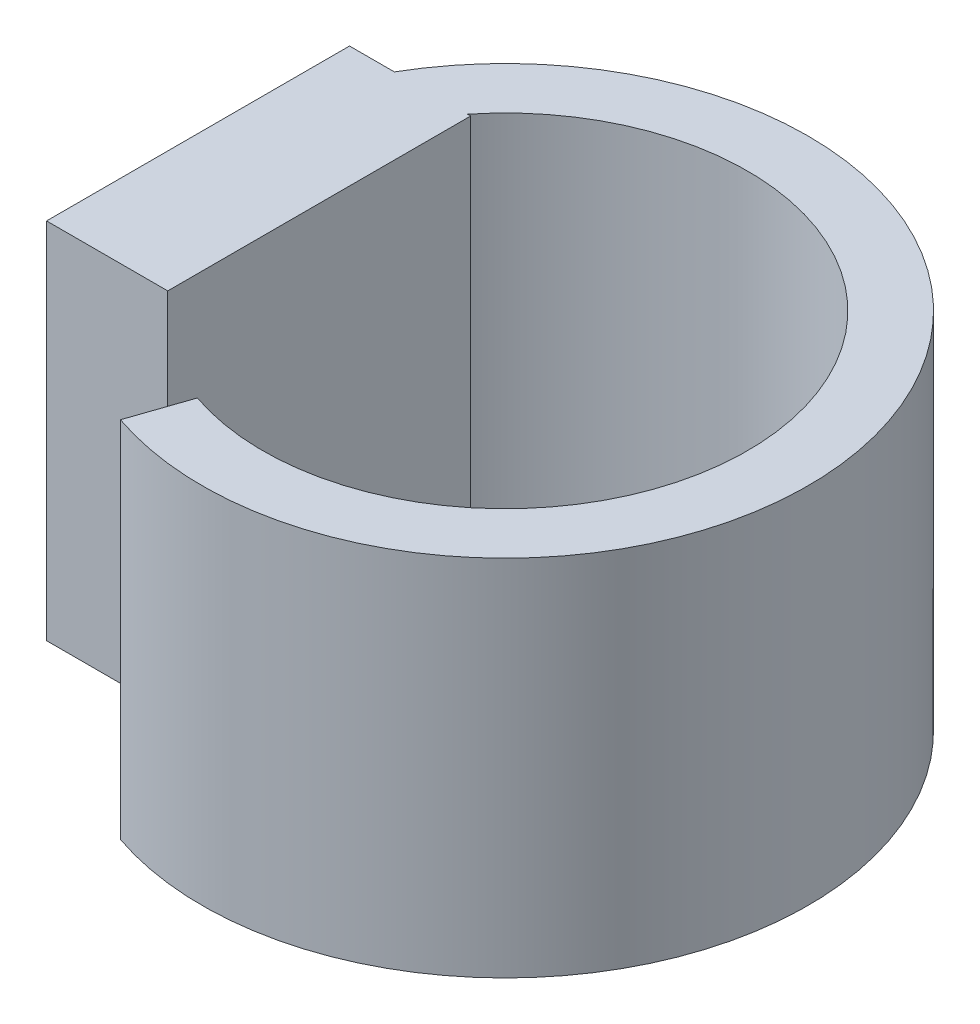
ISO-10303-21;
HEADER;
FILE_DESCRIPTION(('STEP AP214'),'2;1');
FILE_NAME('part.step','',(''),(''),'','','');
FILE_SCHEMA(('AUTOMOTIVE_DESIGN { 1 0 10303 214 1 1 1 1 }'));
ENDSEC;
DATA;
#1=APPLICATION_CONTEXT('core data for automotive mechanical design processes');
#2=APPLICATION_PROTOCOL_DEFINITION('international standard','automotive_design',2000,#1);
#3=PRODUCT_CONTEXT('',#1,'mechanical');
#4=PRODUCT('Part','Part','',(#3));
#5=PRODUCT_RELATED_PRODUCT_CATEGORY('part','',(#4));
#6=PRODUCT_DEFINITION_FORMATION('','',#4);
#7=PRODUCT_DEFINITION_CONTEXT('part definition',#1,'design');
#8=PRODUCT_DEFINITION('design','',#6,#7);
#9=PRODUCT_DEFINITION_SHAPE('','',#8);
#10=(LENGTH_UNIT() NAMED_UNIT(*) SI_UNIT(.MILLI.,.METRE.));
#11=(NAMED_UNIT(*) PLANE_ANGLE_UNIT() SI_UNIT($,.RADIAN.));
#12=(NAMED_UNIT(*) SI_UNIT($,.STERADIAN.) SOLID_ANGLE_UNIT());
#13=UNCERTAINTY_MEASURE_WITH_UNIT(LENGTH_MEASURE(1.E-05),#10,'distance_accuracy_value','');
#14=(GEOMETRIC_REPRESENTATION_CONTEXT(3) GLOBAL_UNCERTAINTY_ASSIGNED_CONTEXT((#13)) GLOBAL_UNIT_ASSIGNED_CONTEXT((#10,
#11,#12)) REPRESENTATION_CONTEXT('',''));
#15=CARTESIAN_POINT('',(0.,0.,0.));
#16=DIRECTION('',(0.,0.,1.));
#17=DIRECTION('',(1.,0.,0.));
#18=AXIS2_PLACEMENT_3D('',#15,#16,#17);
#19=CARTESIAN_POINT('',(0.,12.,0.));
#20=DIRECTION('',(1.,0.,0.));
#21=DIRECTION('',(0.,0.,-1.));
#22=AXIS2_PLACEMENT_3D('',#19,#20,#21);
#23=PLANE('',#22);
#24=DIRECTION('',(0.,0.,1.));
#25=VECTOR('',#24,1.);
#26=CARTESIAN_POINT('',(0.,0.,0.));
#27=LINE('',#26,#25);
#28=CARTESIAN_POINT('',(0.,0.,-10.));
#29=VERTEX_POINT('',#28);
#30=CARTESIAN_POINT('',(0.,0.,0.));
#31=VERTEX_POINT('',#30);
#32=EDGE_CURVE('E129',#29,#31,#27,.T.);
#33=ORIENTED_EDGE('',*,*,#32,.T.);
#34=DIRECTION('',(0.,-1.,0.));
#35=VECTOR('',#34,1.);
#36=CARTESIAN_POINT('',(0.,12.,0.));
#37=LINE('',#36,#35);
#38=CARTESIAN_POINT('',(0.,12.,0.));
#39=VERTEX_POINT('',#38);
#40=EDGE_CURVE('E11',#39,#31,#37,.T.);
#41=ORIENTED_EDGE('',*,*,#40,.F.);
#42=DIRECTION('',(0.,0.,1.));
#43=VECTOR('',#42,1.);
#44=CARTESIAN_POINT('',(0.,12.,0.));
#45=LINE('',#44,#43);
#46=CARTESIAN_POINT('',(0.,12.,-10.));
#47=VERTEX_POINT('',#46);
#48=EDGE_CURVE('E143',#47,#39,#45,.T.);
#49=ORIENTED_EDGE('',*,*,#48,.F.);
#50=DIRECTION('',(0.,-1.,0.));
#51=VECTOR('',#50,1.);
#52=CARTESIAN_POINT('',(0.,12.,-10.));
#53=LINE('',#52,#51);
#54=EDGE_CURVE('E125',#47,#29,#53,.T.);
#55=ORIENTED_EDGE('',*,*,#54,.T.);
#56=EDGE_LOOP('',(#33,#41,#49,#55));
#57=FACE_BOUND('',#56,.T.);
#58=ADVANCED_FACE('F33',(#57),#23,.F.);
#59=CARTESIAN_POINT('',(0.,12.,0.));
#60=DIRECTION('',(0.,0.,-1.));
#61=DIRECTION('',(-1.,0.,0.));
#62=AXIS2_PLACEMENT_3D('',#59,#60,#61);
#63=PLANE('',#62);
#64=DIRECTION('',(1.,0.,0.));
#65=VECTOR('',#64,1.);
#66=CARTESIAN_POINT('',(0.,0.,0.));
#67=LINE('',#66,#65);
#68=CARTESIAN_POINT('',(4.,0.,0.));
#69=VERTEX_POINT('',#68);
#70=EDGE_CURVE('E132',#31,#69,#67,.T.);
#71=ORIENTED_EDGE('',*,*,#70,.T.);
#72=DIRECTION('',(0.,-1.,0.));
#73=VECTOR('',#72,1.);
#74=CARTESIAN_POINT('',(4.,12.,0.));
#75=LINE('',#74,#73);
#76=CARTESIAN_POINT('',(4.,12.,0.));
#77=VERTEX_POINT('',#76);
#78=EDGE_CURVE('E41',#77,#69,#75,.T.);
#79=ORIENTED_EDGE('',*,*,#78,.F.);
#80=DIRECTION('',(1.,0.,0.));
#81=VECTOR('',#80,1.);
#82=CARTESIAN_POINT('',(0.,12.,0.));
#83=LINE('',#82,#81);
#84=EDGE_CURVE('E92',#39,#77,#83,.T.);
#85=ORIENTED_EDGE('',*,*,#84,.F.);
#86=ORIENTED_EDGE('',*,*,#40,.T.);
#87=EDGE_LOOP('',(#71,#79,#85,#86));
#88=FACE_BOUND('',#87,.T.);
#89=ADVANCED_FACE('F178',(#88),#63,.F.);
#90=CARTESIAN_POINT('',(4.,12.,0.));
#91=DIRECTION('',(-1.,0.,0.));
#92=DIRECTION('',(0.,0.,1.));
#93=AXIS2_PLACEMENT_3D('',#90,#91,#92);
#94=PLANE('',#93);
#95=DIRECTION('',(0.,0.,-1.));
#96=VECTOR('',#95,1.);
#97=CARTESIAN_POINT('',(4.,0.,0.));
#98=LINE('',#97,#96);
#99=CARTESIAN_POINT('',(4.,0.,-10.));
#100=VERTEX_POINT('',#99);
#101=EDGE_CURVE('E134',#69,#100,#98,.T.);
#102=ORIENTED_EDGE('',*,*,#101,.T.);
#103=DIRECTION('',(0.,-1.,0.));
#104=VECTOR('',#103,1.);
#105=CARTESIAN_POINT('',(4.,12.,-10.));
#106=LINE('',#105,#104);
#107=CARTESIAN_POINT('',(4.,12.,-10.));
#108=VERTEX_POINT('',#107);
#109=EDGE_CURVE('E150',#108,#100,#106,.T.);
#110=ORIENTED_EDGE('',*,*,#109,.F.);
#111=DIRECTION('',(0.,0.,-1.));
#112=VECTOR('',#111,1.);
#113=CARTESIAN_POINT('',(4.,12.,0.));
#114=LINE('',#113,#112);
#115=EDGE_CURVE('E158',#77,#108,#114,.T.);
#116=ORIENTED_EDGE('',*,*,#115,.F.);
#117=ORIENTED_EDGE('',*,*,#78,.T.);
#118=EDGE_LOOP('',(#102,#110,#116,#117));
#119=FACE_BOUND('',#118,.T.);
#120=ADVANCED_FACE('F156',(#119),#94,.F.);
#121=CARTESIAN_POINT('',(3.89619072953186,12.,-10.));
#122=DIRECTION('',(0.,0.,1.));
#123=DIRECTION('',(1.,0.,0.));
#124=AXIS2_PLACEMENT_3D('',#121,#122,#123);
#125=PLANE('',#124);
#126=DIRECTION('',(-1.,0.,0.));
#127=VECTOR('',#126,1.);
#128=CARTESIAN_POINT('',(3.89619072953186,0.,-10.));
#129=LINE('',#128,#127);
#130=CARTESIAN_POINT('',(3.89619072953186,0.,-10.));
#131=VERTEX_POINT('',#130);
#132=EDGE_CURVE('E136',#100,#131,#129,.T.);
#133=ORIENTED_EDGE('',*,*,#132,.T.);
#134=DIRECTION('',(0.,-1.,0.));
#135=VECTOR('',#134,1.);
#136=CARTESIAN_POINT('',(3.89619072953186,12.,-10.));
#137=LINE('',#136,#135);
#138=CARTESIAN_POINT('',(3.89619072953186,12.,-10.));
#139=VERTEX_POINT('',#138);
#140=EDGE_CURVE('E147',#139,#131,#137,.T.);
#141=ORIENTED_EDGE('',*,*,#140,.F.);
#142=DIRECTION('',(-1.,0.,0.));
#143=VECTOR('',#142,1.);
#144=CARTESIAN_POINT('',(3.89619072953186,12.,-10.));
#145=LINE('',#144,#143);
#146=EDGE_CURVE('E170',#108,#139,#145,.T.);
#147=ORIENTED_EDGE('',*,*,#146,.F.);
#148=ORIENTED_EDGE('',*,*,#109,.T.);
#149=EDGE_LOOP('',(#133,#141,#147,#148));
#150=FACE_BOUND('',#149,.T.);
#151=ADVANCED_FACE('F166',(#150),#125,.F.);
#152=CARTESIAN_POINT('',(10.1389820031373,12.,-4.99724504755669));
#153=DIRECTION('',(0.,-1.,0.));
#154=DIRECTION('',(0.,0.,-1.));
#155=AXIS2_PLACEMENT_3D('',#152,#153,#154);
#156=CYLINDRICAL_SURFACE('',#155,8.);
#157=CARTESIAN_POINT('',(10.1389820031373,0.,-4.99724504755669));
#158=DIRECTION('',(0.,-1.,0.));
#159=DIRECTION('',(0.,0.,1.));
#160=AXIS2_PLACEMENT_3D('',#157,#158,#159);
#161=CIRCLE('',#160,8.);
#162=CARTESIAN_POINT('',(7.55030258883941,0.,2.5723479989677));
#163=VERTEX_POINT('',#162);
#164=EDGE_CURVE('E138',#131,#163,#161,.T.);
#165=ORIENTED_EDGE('',*,*,#164,.T.);
#166=DIRECTION('',(0.,-1.,0.));
#167=VECTOR('',#166,1.);
#168=CARTESIAN_POINT('',(7.55030258883941,12.,2.5723479989677));
#169=LINE('',#168,#167);
#170=CARTESIAN_POINT('',(7.55030258883941,12.,2.5723479989677));
#171=VERTEX_POINT('',#170);
#172=EDGE_CURVE('E120',#171,#163,#169,.T.);
#173=ORIENTED_EDGE('',*,*,#172,.F.);
#174=CARTESIAN_POINT('',(10.1389820031373,12.,-4.99724504755669));
#175=DIRECTION('',(0.,-1.,0.));
#176=DIRECTION('',(0.,0.,1.));
#177=AXIS2_PLACEMENT_3D('',#174,#175,#176);
#178=CIRCLE('',#177,8.);
#179=EDGE_CURVE('E111',#139,#171,#178,.T.);
#180=ORIENTED_EDGE('',*,*,#179,.F.);
#181=ORIENTED_EDGE('',*,*,#140,.T.);
#182=EDGE_LOOP('',(#165,#173,#180,#181));
#183=FACE_BOUND('',#182,.T.);
#184=ADVANCED_FACE('F169',(#183),#156,.F.);
#185=CARTESIAN_POINT('',(7.55030258883941,12.,2.5723479989677));
#186=DIRECTION('',(0.946199130815549,0.,0.323584926787234));
#187=DIRECTION('',(0.323584926787234,0.,-0.946199130815549));
#188=AXIS2_PLACEMENT_3D('',#185,#186,#187);
#189=PLANE('',#188);
#190=DIRECTION('',(-0.323584926787234,0.,0.946199130815549));
#191=VECTOR('',#190,1.);
#192=CARTESIAN_POINT('',(7.55030258883941,0.,2.5723479989677));
#193=LINE('',#192,#191);
#194=CARTESIAN_POINT('',(6.90313273526494,0.,4.4647462605988));
#195=VERTEX_POINT('',#194);
#196=EDGE_CURVE('E119',#163,#195,#193,.T.);
#197=ORIENTED_EDGE('',*,*,#196,.T.);
#198=DIRECTION('',(0.,-1.,0.));
#199=VECTOR('',#198,1.);
#200=CARTESIAN_POINT('',(6.90313273526494,12.,4.4647462605988));
#201=LINE('',#200,#199);
#202=CARTESIAN_POINT('',(6.90313273526494,12.,4.4647462605988));
#203=VERTEX_POINT('',#202);
#204=EDGE_CURVE('E116',#203,#195,#201,.T.);
#205=ORIENTED_EDGE('',*,*,#204,.F.);
#206=DIRECTION('',(-0.323584926787234,0.,0.946199130815549));
#207=VECTOR('',#206,1.);
#208=CARTESIAN_POINT('',(7.55030258883941,12.,2.5723479989677));
#209=LINE('',#208,#207);
#210=EDGE_CURVE('E105',#171,#203,#209,.T.);
#211=ORIENTED_EDGE('',*,*,#210,.F.);
#212=ORIENTED_EDGE('',*,*,#172,.T.);
#213=EDGE_LOOP('',(#197,#205,#211,#212));
#214=FACE_BOUND('',#213,.T.);
#215=ADVANCED_FACE('F117',(#214),#189,.F.);
#216=CARTESIAN_POINT('',(10.1389820031373,12.,-4.99724504755669));
#217=DIRECTION('',(0.,-1.,0.));
#218=DIRECTION('',(0.,0.,-1.));
#219=AXIS2_PLACEMENT_3D('',#216,#217,#218);
#220=CYLINDRICAL_SURFACE('',#219,10.);
#221=CARTESIAN_POINT('',(10.1389820031373,0.,-4.99724504755669));
#222=DIRECTION('',(0.,1.,0.));
#223=DIRECTION('',(0.,0.,1.));
#224=AXIS2_PLACEMENT_3D('',#221,#222,#223);
#225=CIRCLE('',#224,10.);
#226=CARTESIAN_POINT('',(1.48031912219522,0.,-10.));
#227=VERTEX_POINT('',#226);
#228=EDGE_CURVE('E78',#195,#227,#225,.T.);
#229=ORIENTED_EDGE('',*,*,#228,.T.);
#230=DIRECTION('',(0.,-1.,0.));
#231=VECTOR('',#230,1.);
#232=CARTESIAN_POINT('',(1.48031912219522,12.,-10.));
#233=LINE('',#232,#231);
#234=CARTESIAN_POINT('',(1.48031912219522,12.,-10.));
#235=VERTEX_POINT('',#234);
#236=EDGE_CURVE('E121',#235,#227,#233,.T.);
#237=ORIENTED_EDGE('',*,*,#236,.F.);
#238=CARTESIAN_POINT('',(10.1389820031373,12.,-4.99724504755669));
#239=DIRECTION('',(0.,1.,0.));
#240=DIRECTION('',(0.,0.,1.));
#241=AXIS2_PLACEMENT_3D('',#238,#239,#240);
#242=CIRCLE('',#241,10.);
#243=EDGE_CURVE('E109',#203,#235,#242,.T.);
#244=ORIENTED_EDGE('',*,*,#243,.F.);
#245=ORIENTED_EDGE('',*,*,#204,.T.);
#246=EDGE_LOOP('',(#229,#237,#244,#245));
#247=FACE_BOUND('',#246,.T.);
#248=ADVANCED_FACE('F123',(#247),#220,.T.);
#249=CARTESIAN_POINT('',(0.,12.,-10.));
#250=DIRECTION('',(0.,0.,1.));
#251=DIRECTION('',(1.,0.,0.));
#252=AXIS2_PLACEMENT_3D('',#249,#250,#251);
#253=PLANE('',#252);
#254=DIRECTION('',(-1.,0.,0.));
#255=VECTOR('',#254,1.);
#256=CARTESIAN_POINT('',(0.,0.,-10.));
#257=LINE('',#256,#255);
#258=EDGE_CURVE('E84',#227,#29,#257,.T.);
#259=ORIENTED_EDGE('',*,*,#258,.T.);
#260=ORIENTED_EDGE('',*,*,#54,.F.);
#261=DIRECTION('',(-1.,0.,0.));
#262=VECTOR('',#261,1.);
#263=CARTESIAN_POINT('',(0.,12.,-10.));
#264=LINE('',#263,#262);
#265=EDGE_CURVE('E49',#235,#47,#264,.T.);
#266=ORIENTED_EDGE('',*,*,#265,.F.);
#267=ORIENTED_EDGE('',*,*,#236,.T.);
#268=EDGE_LOOP('',(#259,#260,#266,#267));
#269=FACE_BOUND('',#268,.T.);
#270=ADVANCED_FACE('F194',(#269),#253,.F.);
#271=CARTESIAN_POINT('',(10.1389820031373,12.,-4.99724504755669));
#272=DIRECTION('',(0.,1.,0.));
#273=DIRECTION('',(0.,0.,1.));
#274=AXIS2_PLACEMENT_3D('',#271,#272,#273);
#275=PLANE('',#274);
#276=ORIENTED_EDGE('',*,*,#48,.T.);
#277=ORIENTED_EDGE('',*,*,#84,.T.);
#278=ORIENTED_EDGE('',*,*,#115,.T.);
#279=ORIENTED_EDGE('',*,*,#146,.T.);
#280=ORIENTED_EDGE('',*,*,#179,.T.);
#281=ORIENTED_EDGE('',*,*,#210,.T.);
#282=ORIENTED_EDGE('',*,*,#243,.T.);
#283=ORIENTED_EDGE('',*,*,#265,.T.);
#284=EDGE_LOOP('',(#276,#277,#278,#279,#280,#281,#282,#283));
#285=FACE_BOUND('',#284,.T.);
#286=ADVANCED_FACE('F107',(#285),#275,.T.);
#287=CARTESIAN_POINT('',(10.1389820031373,0.,-4.99724504755669));
#288=DIRECTION('',(0.,1.,0.));
#289=DIRECTION('',(0.,0.,1.));
#290=AXIS2_PLACEMENT_3D('',#287,#288,#289);
#291=PLANE('',#290);
#292=ORIENTED_EDGE('',*,*,#32,.F.);
#293=ORIENTED_EDGE('',*,*,#258,.F.);
#294=ORIENTED_EDGE('',*,*,#228,.F.);
#295=ORIENTED_EDGE('',*,*,#196,.F.);
#296=ORIENTED_EDGE('',*,*,#164,.F.);
#297=ORIENTED_EDGE('',*,*,#132,.F.);
#298=ORIENTED_EDGE('',*,*,#101,.F.);
#299=ORIENTED_EDGE('',*,*,#70,.F.);
#300=EDGE_LOOP('',(#292,#293,#294,#295,#296,#297,#298,#299));
#301=FACE_BOUND('',#300,.T.);
#302=ADVANCED_FACE('F162',(#301),#291,.F.);
#303=CLOSED_SHELL('',(#58,#89,#120,#151,#184,#215,#248,#270,#286,#302));
#304=MANIFOLD_SOLID_BREP('B2',#303);
#305=ADVANCED_BREP_SHAPE_REPRESENTATION('',(#18,#304),#14);
#306=SHAPE_DEFINITION_REPRESENTATION(#9,#305);
ENDSEC;
END-ISO-10303-21;
